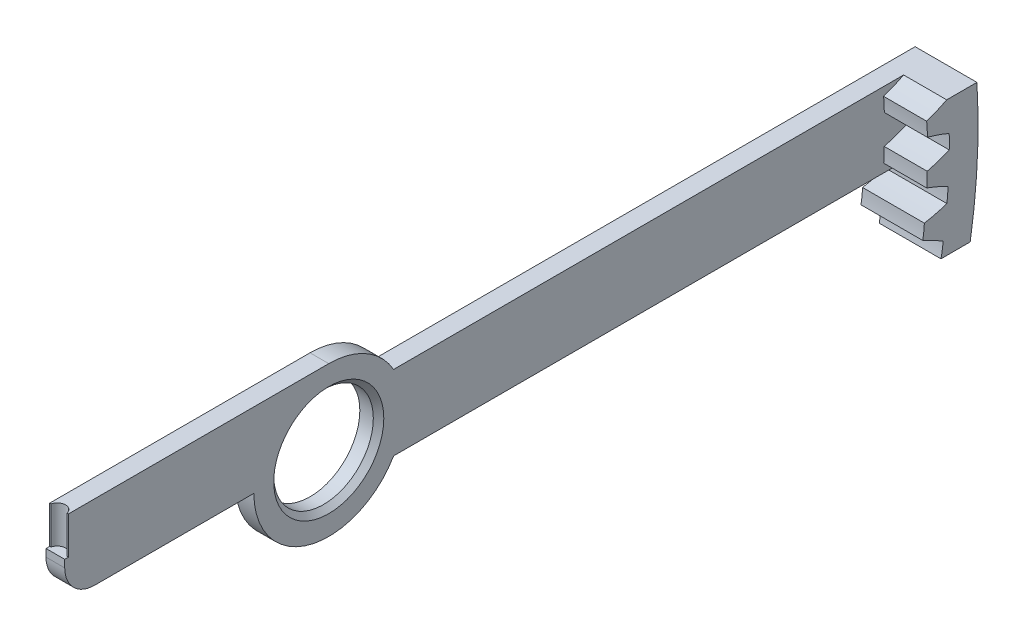
ISO-10303-21;
HEADER;
FILE_DESCRIPTION(('STEP AP214'),'2;1');
FILE_NAME('part.step','',(''),(''),'','','');
FILE_SCHEMA(('AUTOMOTIVE_DESIGN { 1 0 10303 214 1 1 1 1 }'));
ENDSEC;
DATA;
#1=APPLICATION_CONTEXT('core data for automotive mechanical design processes');
#2=APPLICATION_PROTOCOL_DEFINITION('international standard','automotive_design',2000,#1);
#3=PRODUCT_CONTEXT('',#1,'mechanical');
#4=PRODUCT('Part','Part','',(#3));
#5=PRODUCT_RELATED_PRODUCT_CATEGORY('part','',(#4));
#6=PRODUCT_DEFINITION_FORMATION('','',#4);
#7=PRODUCT_DEFINITION_CONTEXT('part definition',#1,'design');
#8=PRODUCT_DEFINITION('design','',#6,#7);
#9=PRODUCT_DEFINITION_SHAPE('','',#8);
#10=(LENGTH_UNIT() NAMED_UNIT(*) SI_UNIT(.MILLI.,.METRE.));
#11=(NAMED_UNIT(*) PLANE_ANGLE_UNIT() SI_UNIT($,.RADIAN.));
#12=(NAMED_UNIT(*) SI_UNIT($,.STERADIAN.) SOLID_ANGLE_UNIT());
#13=UNCERTAINTY_MEASURE_WITH_UNIT(LENGTH_MEASURE(1.E-05),#10,'distance_accuracy_value','');
#14=(GEOMETRIC_REPRESENTATION_CONTEXT(3) GLOBAL_UNCERTAINTY_ASSIGNED_CONTEXT((#13)) GLOBAL_UNIT_ASSIGNED_CONTEXT((#10,
#11,#12)) REPRESENTATION_CONTEXT('',''));
#15=CARTESIAN_POINT('',(0.,0.,0.));
#16=DIRECTION('',(0.,0.,1.));
#17=DIRECTION('',(1.,0.,0.));
#18=AXIS2_PLACEMENT_3D('',#15,#16,#17);
#19=CARTESIAN_POINT('',(-1.25,0.,0.));
#20=DIRECTION('',(1.,0.,0.));
#21=DIRECTION('',(0.,0.,-1.));
#22=AXIS2_PLACEMENT_3D('',#19,#20,#21);
#23=PLANE('',#22);
#24=CARTESIAN_POINT('',(-1.25,0.,0.));
#25=DIRECTION('',(1.,0.,0.));
#26=DIRECTION('',(0.,0.,-1.));
#27=AXIS2_PLACEMENT_3D('',#24,#25,#26);
#28=CIRCLE('',#27,6.65);
#29=CARTESIAN_POINT('',(-1.25,0.,-6.65));
#30=VERTEX_POINT('',#29);
#31=EDGE_CURVE('E323',#30,#30,#28,.T.);
#32=ORIENTED_EDGE('',*,*,#31,.T.);
#33=EDGE_LOOP('',(#32));
#34=FACE_BOUND('',#33,.T.);
#35=DIRECTION('',(0.,0.,-1.));
#36=VECTOR('',#35,1.);
#37=CARTESIAN_POINT('',(-1.25,5.00000000000256,0.));
#38=LINE('',#37,#36);
#39=CARTESIAN_POINT('',(-1.25,5.00000000000215,-8.66025403784314));
#40=VERTEX_POINT('',#39);
#41=CARTESIAN_POINT('',(-1.25,5.00000000000252,-80.7873729860266));
#42=VERTEX_POINT('',#41);
#43=EDGE_CURVE('E377',#40,#42,#38,.T.);
#44=ORIENTED_EDGE('',*,*,#43,.T.);
#45=CARTESIAN_POINT('',(-1.25,0.,0.));
#46=DIRECTION('',(1.,0.,0.));
#47=DIRECTION('',(0.,0.,-1.));
#48=AXIS2_PLACEMENT_3D('',#45,#46,#47);
#49=CIRCLE('',#48,80.9419522496424);
#50=CARTESIAN_POINT('',(-1.25,-13.,-79.8911736926139));
#51=VERTEX_POINT('',#50);
#52=EDGE_CURVE('E228',#51,#42,#49,.T.);
#53=ORIENTED_EDGE('',*,*,#52,.F.);
#54=DIRECTION('',(0.,-0.00180073265699237,0.999998378679635));
#55=VECTOR('',#54,1.);
#56=CARTESIAN_POINT('',(-1.25,-13.143820257931,-0.0236685447503879));
#57=LINE('',#56,#55);
#58=CARTESIAN_POINT('',(-1.25,-13.0070274493974,-75.988629927215));
#59=VERTEX_POINT('',#58);
#60=EDGE_CURVE('E273',#51,#59,#57,.T.);
#61=ORIENTED_EDGE('',*,*,#60,.T.);
#62=CARTESIAN_POINT('',(-1.25,-9.13823875480682,-57.4101745950475));
#63=DIRECTION('',(1.,0.,0.));
#64=DIRECTION('',(0.,0.,-1.));
#65=AXIS2_PLACEMENT_3D('',#62,#63,#64);
#66=CIRCLE('',#65,18.9769999866347);
#67=CARTESIAN_POINT('',(-1.25,-11.1228967498483,-76.2831092141112));
#68=VERTEX_POINT('',#67);
#69=EDGE_CURVE('E289',#68,#59,#66,.F.);
#70=ORIENTED_EDGE('',*,*,#69,.F.);
#71=CARTESIAN_POINT('',(-1.25,-28.8123858408192,-65.0957103825798));
#72=DIRECTION('',(1.,0.,0.));
#73=DIRECTION('',(0.,0.,-1.));
#74=AXIS2_PLACEMENT_3D('',#71,#72,#73);
#75=CIRCLE('',#74,20.9302631831359);
#76=CARTESIAN_POINT('',(-1.25,-9.66965269382754,-73.5592607356179));
#77=VERTEX_POINT('',#76);
#78=EDGE_CURVE('E287',#68,#77,#75,.T.);
#79=ORIENTED_EDGE('',*,*,#78,.T.);
#80=CARTESIAN_POINT('',(-1.25,-6.90534373335352,-57.0702324075885));
#81=DIRECTION('',(1.,0.,0.));
#82=DIRECTION('',(0.,0.,-1.));
#83=AXIS2_PLACEMENT_3D('',#80,#81,#82);
#84=CIRCLE('',#83,16.7191345239971);
#85=CARTESIAN_POINT('',(-1.25,-7.76663181357915,-73.7671675177918));
#86=VERTEX_POINT('',#85);
#87=EDGE_CURVE('E284',#86,#77,#84,.F.);
#88=ORIENTED_EDGE('',*,*,#87,.F.);
#89=CARTESIAN_POINT('',(-1.25,10.9578906175946,-70.6255537554951));
#90=DIRECTION('',(1.,0.,0.));
#91=DIRECTION('',(0.,0.,-1.));
#92=AXIS2_PLACEMENT_3D('',#89,#90,#91);
#93=CIRCLE('',#92,18.9862444234499);
#94=CARTESIAN_POINT('',(-1.25,-7.00493193495975,-76.7749019528595));
#95=VERTEX_POINT('',#94);
#96=EDGE_CURVE('E282',#86,#95,#93,.T.);
#97=ORIENTED_EDGE('',*,*,#96,.T.);
#98=CARTESIAN_POINT('',(-1.25,-4.60571823015363,-57.9501761356954));
#99=DIRECTION('',(1.,0.,0.));
#100=DIRECTION('',(0.,0.,-1.));
#101=AXIS2_PLACEMENT_3D('',#98,#99,#100);
#102=CIRCLE('',#101,18.9769999866347);
#103=CARTESIAN_POINT('',(-1.25,-5.1035048029999,-76.9206462674721));
#104=VERTEX_POINT('',#103);
#105=EDGE_CURVE('E279',#104,#95,#102,.F.);
#106=ORIENTED_EDGE('',*,*,#105,.F.);
#107=CARTESIAN_POINT('',(-1.25,-23.6162162985407,-67.1556357708977));
#108=DIRECTION('',(1.,0.,0.));
#109=DIRECTION('',(0.,0.,-1.));
#110=AXIS2_PLACEMENT_3D('',#107,#108,#109);
#111=CIRCLE('',#110,20.9302631831359);
#112=CARTESIAN_POINT('',(-1.25,-5.00000000000254,-76.7218475415711));
#113=VERTEX_POINT('',#112);
#114=EDGE_CURVE('E276',#104,#113,#111,.T.);
#115=ORIENTED_EDGE('',*,*,#114,.T.);
#116=DIRECTION('',(0.,0.,1.));
#117=VECTOR('',#116,1.);
#118=CARTESIAN_POINT('',(-1.25,-5.00000000000211,0.));
#119=LINE('',#118,#117);
#120=CARTESIAN_POINT('',(-1.25,-5.00000000000216,-8.66025403784314));
#121=VERTEX_POINT('',#120);
#122=EDGE_CURVE('E373',#113,#121,#119,.T.);
#123=ORIENTED_EDGE('',*,*,#122,.T.);
#124=CARTESIAN_POINT('',(-1.25,0.,0.));
#125=DIRECTION('',(1.,0.,0.));
#126=DIRECTION('',(0.,0.,-1.));
#127=AXIS2_PLACEMENT_3D('',#124,#125,#126);
#128=CIRCLE('',#127,10.);
#129=CARTESIAN_POINT('',(-1.25,0.,10.));
#130=VERTEX_POINT('',#129);
#131=EDGE_CURVE('E370',#130,#121,#128,.T.);
#132=ORIENTED_EDGE('',*,*,#131,.F.);
#133=DIRECTION('',(0.,0.,1.));
#134=VECTOR('',#133,1.);
#135=CARTESIAN_POINT('',(-1.25,0.,0.));
#136=LINE('',#135,#134);
#137=CARTESIAN_POINT('',(-1.25,0.,31.25));
#138=VERTEX_POINT('',#137);
#139=EDGE_CURVE('E367',#130,#138,#136,.T.);
#140=ORIENTED_EDGE('',*,*,#139,.T.);
#141=CARTESIAN_POINT('',(-1.25,4.,31.25));
#142=DIRECTION('',(1.,0.,0.));
#143=DIRECTION('',(0.,0.,-1.));
#144=AXIS2_PLACEMENT_3D('',#141,#142,#143);
#145=CIRCLE('',#144,4.);
#146=CARTESIAN_POINT('',(-1.25,4.00000000000002,35.25));
#147=VERTEX_POINT('',#146);
#148=EDGE_CURVE('E364',#147,#138,#145,.T.);
#149=ORIENTED_EDGE('',*,*,#148,.F.);
#150=DIRECTION('',(0.,-1.,0.));
#151=VECTOR('',#150,1.);
#152=CARTESIAN_POINT('',(-1.25,0.,35.25));
#153=LINE('',#152,#151);
#154=CARTESIAN_POINT('',(-1.25,4.99999999999999,35.25));
#155=VERTEX_POINT('',#154);
#156=EDGE_CURVE('E295',#155,#147,#153,.T.);
#157=ORIENTED_EDGE('',*,*,#156,.F.);
#158=DIRECTION('',(0.,0.,-1.));
#159=VECTOR('',#158,1.);
#160=CARTESIAN_POINT('',(-1.25,4.99999999999999,0.));
#161=LINE('',#160,#159);
#162=CARTESIAN_POINT('',(-1.25,4.99999999999999,34.75));
#163=VERTEX_POINT('',#162);
#164=EDGE_CURVE('E385',#155,#163,#161,.T.);
#165=ORIENTED_EDGE('',*,*,#164,.T.);
#166=DIRECTION('',(0.,-1.,0.));
#167=VECTOR('',#166,1.);
#168=CARTESIAN_POINT('',(-1.25,0.,34.75));
#169=LINE('',#168,#167);
#170=CARTESIAN_POINT('',(-1.25,9.99999999999999,34.75));
#171=VERTEX_POINT('',#170);
#172=EDGE_CURVE('E382',#171,#163,#169,.T.);
#173=ORIENTED_EDGE('',*,*,#172,.F.);
#174=DIRECTION('',(0.,0.,1.));
#175=VECTOR('',#174,1.);
#176=CARTESIAN_POINT('',(-1.25,9.99999999999999,0.));
#177=LINE('',#176,#175);
#178=CARTESIAN_POINT('',(-1.25,9.99999999999999,0.));
#179=VERTEX_POINT('',#178);
#180=EDGE_CURVE('E379',#179,#171,#177,.T.);
#181=ORIENTED_EDGE('',*,*,#180,.F.);
#182=EDGE_CURVE('E374',#40,#179,#128,.T.);
#183=ORIENTED_EDGE('',*,*,#182,.F.);
#184=EDGE_LOOP('',(#44,#53,#61,#70,#79,#88,#97,#106,#115,#123,#132,#140,#149,#157,#165,#173,
#181,#183));
#185=FACE_BOUND('',#184,.T.);
#186=ADVANCED_FACE('F37',(#34,#185),#23,.F.);
#187=CARTESIAN_POINT('',(-1.25,21.8712515204259,-68.0418442356442));
#188=DIRECTION('',(1.,0.,0.));
#189=DIRECTION('',(0.,0.,-1.));
#190=AXIS2_PLACEMENT_3D('',#187,#188,#189);
#191=CYLINDRICAL_SURFACE('',#190,18.9862444234499);
#192=DIRECTION('',(1.,0.,0.));
#193=VECTOR('',#192,1.);
#194=CARTESIAN_POINT('',(-1.25,5.00000000000252,-76.7503658921365));
#195=LINE('',#194,#193);
#196=CARTESIAN_POINT('',(1.25,5.00000000000252,-76.7503658921365));
#197=VERTEX_POINT('',#196);
#198=CARTESIAN_POINT('',(7.,5.00000000000252,-76.7503658921365));
#199=VERTEX_POINT('',#198);
#200=EDGE_CURVE('E52',#197,#199,#195,.T.);
#201=ORIENTED_EDGE('',*,*,#200,.F.);
#202=CARTESIAN_POINT('',(1.25,21.8712515204259,-68.0418442356442));
#203=DIRECTION('',(1.,0.,0.));
#204=DIRECTION('',(0.,0.,-1.));
#205=AXIS2_PLACEMENT_3D('',#202,#203,#204);
#206=CIRCLE('',#205,18.9862444234499);
#207=CARTESIAN_POINT('',(1.25,3.86871570021124,-74.0739401689721));
#208=VERTEX_POINT('',#207);
#209=EDGE_CURVE('E349',#208,#197,#206,.T.);
#210=ORIENTED_EDGE('',*,*,#209,.F.);
#211=DIRECTION('',(1.,0.,0.));
#212=VECTOR('',#211,1.);
#213=CARTESIAN_POINT('',(-1.25,3.86871570021124,-74.0739401689721));
#214=LINE('',#213,#212);
#215=CARTESIAN_POINT('',(7.,3.86871570021124,-74.0739401689721));
#216=VERTEX_POINT('',#215);
#217=EDGE_CURVE('E316',#208,#216,#214,.T.);
#218=ORIENTED_EDGE('',*,*,#217,.T.);
#219=CARTESIAN_POINT('',(7.,21.8712515204259,-68.0418442356442));
#220=DIRECTION('',(1.,0.,0.));
#221=DIRECTION('',(0.,0.,-1.));
#222=AXIS2_PLACEMENT_3D('',#219,#220,#221);
#223=CIRCLE('',#222,18.9862444234499);
#224=EDGE_CURVE('E234',#216,#199,#223,.T.);
#225=ORIENTED_EDGE('',*,*,#224,.T.);
#226=EDGE_LOOP('',(#201,#210,#218,#225));
#227=FACE_BOUND('',#226,.T.);
#228=ADVANCED_FACE('F437',(#227),#191,.F.);
#229=CARTESIAN_POINT('',(-1.25,0.,0.));
#230=DIRECTION('',(1.,0.,0.));
#231=DIRECTION('',(0.,0.,-1.));
#232=AXIS2_PLACEMENT_3D('',#229,#230,#231);
#233=CYLINDRICAL_SURFACE('',#232,80.9419522496424);
#234=ORIENTED_EDGE('',*,*,#52,.T.);
#235=DIRECTION('',(1.,0.,0.));
#236=VECTOR('',#235,1.);
#237=CARTESIAN_POINT('',(-1.25,5.00000000000252,-80.7873729860266));
#238=LINE('',#237,#236);
#239=CARTESIAN_POINT('',(7.,5.00000000000252,-80.7873729860266));
#240=VERTEX_POINT('',#239);
#241=EDGE_CURVE('E216',#42,#240,#238,.T.);
#242=ORIENTED_EDGE('',*,*,#241,.T.);
#243=CARTESIAN_POINT('',(7.,0.,0.));
#244=DIRECTION('',(1.,0.,0.));
#245=DIRECTION('',(0.,0.,-1.));
#246=AXIS2_PLACEMENT_3D('',#243,#244,#245);
#247=CIRCLE('',#246,80.9419522496424);
#248=CARTESIAN_POINT('',(7.,-13.,-79.8911736926139));
#249=VERTEX_POINT('',#248);
#250=EDGE_CURVE('E225',#249,#240,#247,.T.);
#251=ORIENTED_EDGE('',*,*,#250,.F.);
#252=DIRECTION('',(1.,0.,0.));
#253=VECTOR('',#252,1.);
#254=CARTESIAN_POINT('',(-1.25,-13.,-79.8911736926139));
#255=LINE('',#254,#253);
#256=EDGE_CURVE('E292',#51,#249,#255,.T.);
#257=ORIENTED_EDGE('',*,*,#256,.F.);
#258=EDGE_LOOP('',(#234,#242,#251,#257));
#259=FACE_BOUND('',#258,.T.);
#260=ADVANCED_FACE('F224',(#259),#233,.T.);
#261=CARTESIAN_POINT('',(7.,0.,0.));
#262=DIRECTION('',(1.,0.,0.));
#263=DIRECTION('',(0.,0.,-1.));
#264=AXIS2_PLACEMENT_3D('',#261,#262,#263);
#265=PLANE('',#264);
#266=ORIENTED_EDGE('',*,*,#250,.T.);
#267=DIRECTION('',(0.,0.,1.));
#268=VECTOR('',#267,1.);
#269=CARTESIAN_POINT('',(7.,5.00000000000252,0.));
#270=LINE('',#269,#268);
#271=EDGE_CURVE('E11',#240,#199,#270,.T.);
#272=ORIENTED_EDGE('',*,*,#271,.T.);
#273=ORIENTED_EDGE('',*,*,#224,.F.);
#274=CARTESIAN_POINT('',(7.,2.10742378316781,-57.447836896876));
#275=DIRECTION('',(1.,0.,0.));
#276=DIRECTION('',(0.,0.,-1.));
#277=AXIS2_PLACEMENT_3D('',#274,#275,#276);
#278=CIRCLE('',#277,16.7191345239952);
#279=CARTESIAN_POINT('',(7.,1.95660037863342,-74.1662911176493));
#280=VERTEX_POINT('',#279);
#281=EDGE_CURVE('E236',#216,#280,#278,.F.);
#282=ORIENTED_EDGE('',*,*,#281,.T.);
#283=CARTESIAN_POINT('',(7.,-18.2744449295929,-68.8015243331729));
#284=DIRECTION('',(1.,0.,0.));
#285=DIRECTION('',(0.,0.,-1.));
#286=AXIS2_PLACEMENT_3D('',#283,#284,#285);
#287=CIRCLE('',#286,20.9302631831357);
#288=CARTESIAN_POINT('',(7.,0.947351948046231,-77.0839419578831));
#289=VERTEX_POINT('',#288);
#290=EDGE_CURVE('E244',#289,#280,#287,.T.);
#291=ORIENTED_EDGE('',*,*,#290,.F.);
#292=CARTESIAN_POINT('',(7.,-0.0448019210548617,-58.1328955700775));
#293=DIRECTION('',(1.,0.,0.));
#294=DIRECTION('',(0.,0.,-1.));
#295=AXIS2_PLACEMENT_3D('',#292,#293,#294);
#296=CIRCLE('',#295,18.9769999866347);
#297=CARTESIAN_POINT('',(7.,-0.959648685766831,-77.0878311777188));
#298=VERTEX_POINT('',#297);
#299=EDGE_CURVE('E247',#289,#298,#296,.F.);
#300=ORIENTED_EDGE('',*,*,#299,.T.);
#301=CARTESIAN_POINT('',(7.,16.4653281807661,-69.5480925544124));
#302=DIRECTION('',(1.,0.,0.));
#303=DIRECTION('',(0.,0.,-1.));
#304=AXIS2_PLACEMENT_3D('',#301,#302,#303);
#305=CIRCLE('',#304,18.9862444234499);
#306=CARTESIAN_POINT('',(7.,-1.95498462182996,-74.1491308678259));
#307=VERTEX_POINT('',#306);
#308=EDGE_CURVE('E250',#307,#298,#305,.T.);
#309=ORIENTED_EDGE('',*,*,#308,.F.);
#310=CARTESIAN_POINT('',(7.,-2.40637803548819,-57.436090952312));
#311=DIRECTION('',(1.,0.,0.));
#312=DIRECTION('',(0.,0.,-1.));
#313=AXIS2_PLACEMENT_3D('',#310,#311,#312);
#314=CIRCLE('',#313,16.7191345239954);
#315=CARTESIAN_POINT('',(7.,-3.8684513019306,-74.0911742902917));
#316=VERTEX_POINT('',#315);
#317=EDGE_CURVE('E253',#307,#316,#314,.F.);
#318=ORIENTED_EDGE('',*,*,#317,.T.);
#319=CARTESIAN_POINT('',(7.,-23.6162162985407,-67.1556357708977));
#320=DIRECTION('',(1.,0.,0.));
#321=DIRECTION('',(0.,0.,-1.));
#322=AXIS2_PLACEMENT_3D('',#319,#320,#321);
#323=CIRCLE('',#322,20.9302631831359);
#324=CARTESIAN_POINT('',(7.,-5.1035048029999,-76.9206462674721));
#325=VERTEX_POINT('',#324);
#326=EDGE_CURVE('E256',#325,#316,#323,.T.);
#327=ORIENTED_EDGE('',*,*,#326,.F.);
#328=CARTESIAN_POINT('',(7.,-4.60571823015363,-57.9501761356954));
#329=DIRECTION('',(1.,0.,0.));
#330=DIRECTION('',(0.,0.,-1.));
#331=AXIS2_PLACEMENT_3D('',#328,#329,#330);
#332=CIRCLE('',#331,18.9769999866347);
#333=CARTESIAN_POINT('',(7.,-7.00493193495975,-76.7749019528595));
#334=VERTEX_POINT('',#333);
#335=EDGE_CURVE('E259',#325,#334,#332,.F.);
#336=ORIENTED_EDGE('',*,*,#335,.T.);
#337=CARTESIAN_POINT('',(7.,10.9578906175946,-70.6255537554951));
#338=DIRECTION('',(1.,0.,0.));
#339=DIRECTION('',(0.,0.,-1.));
#340=AXIS2_PLACEMENT_3D('',#337,#338,#339);
#341=CIRCLE('',#340,18.9862444234499);
#342=CARTESIAN_POINT('',(7.,-7.76663181357915,-73.7671675177918));
#343=VERTEX_POINT('',#342);
#344=EDGE_CURVE('E262',#343,#334,#341,.T.);
#345=ORIENTED_EDGE('',*,*,#344,.F.);
#346=CARTESIAN_POINT('',(7.,-6.90534373335352,-57.0702324075885));
#347=DIRECTION('',(1.,0.,0.));
#348=DIRECTION('',(0.,0.,-1.));
#349=AXIS2_PLACEMENT_3D('',#346,#347,#348);
#350=CIRCLE('',#349,16.7191345239971);
#351=CARTESIAN_POINT('',(7.,-9.66965269382754,-73.5592607356179));
#352=VERTEX_POINT('',#351);
#353=EDGE_CURVE('E265',#343,#352,#350,.F.);
#354=ORIENTED_EDGE('',*,*,#353,.T.);
#355=CARTESIAN_POINT('',(7.,-28.8123858408192,-65.0957103825798));
#356=DIRECTION('',(1.,0.,0.));
#357=DIRECTION('',(0.,0.,-1.));
#358=AXIS2_PLACEMENT_3D('',#355,#356,#357);
#359=CIRCLE('',#358,20.9302631831359);
#360=CARTESIAN_POINT('',(7.,-11.1228967498483,-76.2831092141112));
#361=VERTEX_POINT('',#360);
#362=EDGE_CURVE('E268',#361,#352,#359,.T.);
#363=ORIENTED_EDGE('',*,*,#362,.F.);
#364=CARTESIAN_POINT('',(7.,-9.13823875480682,-57.4101745950475));
#365=DIRECTION('',(1.,0.,0.));
#366=DIRECTION('',(0.,0.,-1.));
#367=AXIS2_PLACEMENT_3D('',#364,#365,#366);
#368=CIRCLE('',#367,18.9769999866347);
#369=CARTESIAN_POINT('',(7.,-13.0070274493974,-75.988629927215));
#370=VERTEX_POINT('',#369);
#371=EDGE_CURVE('E271',#361,#370,#368,.F.);
#372=ORIENTED_EDGE('',*,*,#371,.T.);
#373=DIRECTION('',(0.,-0.00180073265699237,0.999998378679635));
#374=VECTOR('',#373,1.);
#375=CARTESIAN_POINT('',(7.,-13.143820257931,-0.0236685447503879));
#376=LINE('',#375,#374);
#377=EDGE_CURVE('E233',#249,#370,#376,.T.);
#378=ORIENTED_EDGE('',*,*,#377,.F.);
#379=EDGE_LOOP('',(#266,#272,#273,#282,#291,#300,#309,#318,#327,#336,#345,#354,#363,#372,#378));
#380=FACE_BOUND('',#379,.T.);
#381=ADVANCED_FACE('F230',(#380),#265,.T.);
#382=CARTESIAN_POINT('',(1.25,0.,34.75));
#383=DIRECTION('',(0.,0.,-1.));
#384=DIRECTION('',(-1.,0.,0.));
#385=AXIS2_PLACEMENT_3D('',#382,#383,#384);
#386=PLANE('',#385);
#387=DIRECTION('',(-1.,0.,0.));
#388=VECTOR('',#387,1.);
#389=CARTESIAN_POINT('',(1.25,4.99999999999999,34.75));
#390=LINE('',#389,#388);
#391=CARTESIAN_POINT('',(-1.07121426428143,4.99999999999999,34.75));
#392=VERTEX_POINT('',#391);
#393=EDGE_CURVE('E391',#392,#163,#390,.T.);
#394=ORIENTED_EDGE('',*,*,#393,.F.);
#395=DIRECTION('',(0.,1.,0.));
#396=VECTOR('',#395,1.);
#397=CARTESIAN_POINT('',(-1.07121426428143,4.99999999999999,34.75));
#398=LINE('',#397,#396);
#399=CARTESIAN_POINT('',(-1.07121426428143,9.99999999999999,34.75));
#400=VERTEX_POINT('',#399);
#401=EDGE_CURVE('E238',#392,#400,#398,.T.);
#402=ORIENTED_EDGE('',*,*,#401,.T.);
#403=DIRECTION('',(-1.,0.,0.));
#404=VECTOR('',#403,1.);
#405=CARTESIAN_POINT('',(1.25,9.99999999999999,34.75));
#406=LINE('',#405,#404);
#407=EDGE_CURVE('E394',#400,#171,#406,.T.);
#408=ORIENTED_EDGE('',*,*,#407,.T.);
#409=ORIENTED_EDGE('',*,*,#172,.T.);
#410=EDGE_LOOP('',(#394,#402,#408,#409));
#411=FACE_BOUND('',#410,.T.);
#412=ADVANCED_FACE('F528',(#411),#386,.F.);
#413=CARTESIAN_POINT('',(1.25,0.,35.25));
#414=DIRECTION('',(0.,0.,-1.));
#415=DIRECTION('',(-1.,0.,0.));
#416=AXIS2_PLACEMENT_3D('',#413,#414,#415);
#417=PLANE('',#416);
#418=ORIENTED_EDGE('',*,*,#156,.T.);
#419=DIRECTION('',(-1.,0.,0.));
#420=VECTOR('',#419,1.);
#421=CARTESIAN_POINT('',(1.25,4.00000000000002,35.25));
#422=LINE('',#421,#420);
#423=CARTESIAN_POINT('',(1.25,4.00000000000002,35.25));
#424=VERTEX_POINT('',#423);
#425=EDGE_CURVE('E412',#424,#147,#422,.T.);
#426=ORIENTED_EDGE('',*,*,#425,.F.);
#427=DIRECTION('',(0.,-1.,0.));
#428=VECTOR('',#427,1.);
#429=CARTESIAN_POINT('',(1.25,0.,35.25));
#430=LINE('',#429,#428);
#431=CARTESIAN_POINT('',(1.25,4.99999999999999,35.25));
#432=VERTEX_POINT('',#431);
#433=EDGE_CURVE('E319',#432,#424,#430,.T.);
#434=ORIENTED_EDGE('',*,*,#433,.F.);
#435=DIRECTION('',(-1.,0.,0.));
#436=VECTOR('',#435,1.);
#437=CARTESIAN_POINT('',(1.25,4.99999999999999,35.25));
#438=LINE('',#437,#436);
#439=EDGE_CURVE('E361',#432,#155,#438,.T.);
#440=ORIENTED_EDGE('',*,*,#439,.T.);
#441=EDGE_LOOP('',(#418,#426,#434,#440));
#442=FACE_BOUND('',#441,.T.);
#443=ADVANCED_FACE('F523',(#442),#417,.F.);
#444=CARTESIAN_POINT('',(1.25,4.,31.25));
#445=DIRECTION('',(-1.,0.,0.));
#446=DIRECTION('',(0.,0.,1.));
#447=AXIS2_PLACEMENT_3D('',#444,#445,#446);
#448=CYLINDRICAL_SURFACE('',#447,4.);
#449=ORIENTED_EDGE('',*,*,#148,.T.);
#450=DIRECTION('',(-1.,0.,0.));
#451=VECTOR('',#450,1.);
#452=CARTESIAN_POINT('',(1.25,0.,31.25));
#453=LINE('',#452,#451);
#454=CARTESIAN_POINT('',(1.25,0.,31.25));
#455=VERTEX_POINT('',#454);
#456=EDGE_CURVE('E410',#455,#138,#453,.T.);
#457=ORIENTED_EDGE('',*,*,#456,.F.);
#458=CARTESIAN_POINT('',(1.25,4.,31.25));
#459=DIRECTION('',(1.,0.,0.));
#460=DIRECTION('',(0.,0.,-1.));
#461=AXIS2_PLACEMENT_3D('',#458,#459,#460);
#462=CIRCLE('',#461,4.);
#463=EDGE_CURVE('E322',#424,#455,#462,.T.);
#464=ORIENTED_EDGE('',*,*,#463,.F.);
#465=ORIENTED_EDGE('',*,*,#425,.T.);
#466=EDGE_LOOP('',(#449,#457,#464,#465));
#467=FACE_BOUND('',#466,.T.);
#468=ADVANCED_FACE('F520',(#467),#448,.T.);
#469=CARTESIAN_POINT('',(1.25,0.,0.));
#470=DIRECTION('',(0.,-1.,0.));
#471=DIRECTION('',(0.,0.,-1.));
#472=AXIS2_PLACEMENT_3D('',#469,#470,#471);
#473=PLANE('',#472);
#474=ORIENTED_EDGE('',*,*,#139,.F.);
#475=DIRECTION('',(-1.,0.,0.));
#476=VECTOR('',#475,1.);
#477=CARTESIAN_POINT('',(1.25,0.,10.));
#478=LINE('',#477,#476);
#479=CARTESIAN_POINT('',(1.25,0.,10.));
#480=VERTEX_POINT('',#479);
#481=EDGE_CURVE('E408',#480,#130,#478,.T.);
#482=ORIENTED_EDGE('',*,*,#481,.F.);
#483=DIRECTION('',(0.,0.,1.));
#484=VECTOR('',#483,1.);
#485=CARTESIAN_POINT('',(1.25,0.,0.));
#486=LINE('',#485,#484);
#487=EDGE_CURVE('E325',#480,#455,#486,.T.);
#488=ORIENTED_EDGE('',*,*,#487,.T.);
#489=ORIENTED_EDGE('',*,*,#456,.T.);
#490=EDGE_LOOP('',(#474,#482,#488,#489));
#491=FACE_BOUND('',#490,.T.);
#492=ADVANCED_FACE('F514',(#491),#473,.T.);
#493=CARTESIAN_POINT('',(1.25,0.,0.));
#494=DIRECTION('',(-1.,0.,0.));
#495=DIRECTION('',(0.,0.,1.));
#496=AXIS2_PLACEMENT_3D('',#493,#494,#495);
#497=CYLINDRICAL_SURFACE('',#496,10.);
#498=ORIENTED_EDGE('',*,*,#131,.T.);
#499=DIRECTION('',(-1.,0.,0.));
#500=VECTOR('',#499,1.);
#501=CARTESIAN_POINT('',(1.25,-5.00000000000216,-8.66025403784314));
#502=LINE('',#501,#500);
#503=CARTESIAN_POINT('',(1.25,-5.00000000000216,-8.66025403784314));
#504=VERTEX_POINT('',#503);
#505=EDGE_CURVE('E406',#504,#121,#502,.T.);
#506=ORIENTED_EDGE('',*,*,#505,.F.);
#507=CARTESIAN_POINT('',(1.25,0.,0.));
#508=DIRECTION('',(1.,0.,0.));
#509=DIRECTION('',(0.,0.,-1.));
#510=AXIS2_PLACEMENT_3D('',#507,#508,#509);
#511=CIRCLE('',#510,10.);
#512=EDGE_CURVE('E328',#480,#504,#511,.T.);
#513=ORIENTED_EDGE('',*,*,#512,.F.);
#514=ORIENTED_EDGE('',*,*,#481,.T.);
#515=EDGE_LOOP('',(#498,#506,#513,#514));
#516=FACE_BOUND('',#515,.T.);
#517=ADVANCED_FACE('F512',(#516),#497,.T.);
#518=CARTESIAN_POINT('',(1.25,-5.00000000000211,0.));
#519=DIRECTION('',(0.,-1.,0.));
#520=DIRECTION('',(0.,0.,-1.));
#521=AXIS2_PLACEMENT_3D('',#518,#519,#520);
#522=PLANE('',#521);
#523=ORIENTED_EDGE('',*,*,#122,.F.);
#524=DIRECTION('',(-1.,0.,0.));
#525=VECTOR('',#524,1.);
#526=CARTESIAN_POINT('',(1.25,-5.00000000000254,-76.7218475415711));
#527=LINE('',#526,#525);
#528=CARTESIAN_POINT('',(1.25,-5.00000000000254,-76.7218475415711));
#529=VERTEX_POINT('',#528);
#530=EDGE_CURVE('E403',#529,#113,#527,.T.);
#531=ORIENTED_EDGE('',*,*,#530,.F.);
#532=DIRECTION('',(0.,0.,1.));
#533=VECTOR('',#532,1.);
#534=CARTESIAN_POINT('',(1.25,-5.00000000000211,0.));
#535=LINE('',#534,#533);
#536=EDGE_CURVE('E330',#529,#504,#535,.T.);
#537=ORIENTED_EDGE('',*,*,#536,.T.);
#538=ORIENTED_EDGE('',*,*,#505,.T.);
#539=EDGE_LOOP('',(#523,#531,#537,#538));
#540=FACE_BOUND('',#539,.T.);
#541=ADVANCED_FACE('F506',(#540),#522,.T.);
#542=CARTESIAN_POINT('',(1.25,5.00000000000256,0.));
#543=DIRECTION('',(0.,1.,0.));
#544=DIRECTION('',(0.,0.,1.));
#545=AXIS2_PLACEMENT_3D('',#542,#543,#544);
#546=PLANE('',#545);
#547=ORIENTED_EDGE('',*,*,#241,.F.);
#548=ORIENTED_EDGE('',*,*,#43,.F.);
#549=DIRECTION('',(-1.,0.,0.));
#550=VECTOR('',#549,1.);
#551=CARTESIAN_POINT('',(1.25,5.00000000000215,-8.66025403784314));
#552=LINE('',#551,#550);
#553=CARTESIAN_POINT('',(1.25,5.00000000000215,-8.66025403784314));
#554=VERTEX_POINT('',#553);
#555=EDGE_CURVE('E401',#554,#40,#552,.T.);
#556=ORIENTED_EDGE('',*,*,#555,.F.);
#557=DIRECTION('',(0.,0.,-1.));
#558=VECTOR('',#557,1.);
#559=CARTESIAN_POINT('',(1.25,5.00000000000256,0.));
#560=LINE('',#559,#558);
#561=EDGE_CURVE('E352',#554,#197,#560,.T.);
#562=ORIENTED_EDGE('',*,*,#561,.T.);
#563=ORIENTED_EDGE('',*,*,#200,.T.);
#564=ORIENTED_EDGE('',*,*,#271,.F.);
#565=EDGE_LOOP('',(#547,#548,#556,#562,#563,#564));
#566=FACE_BOUND('',#565,.T.);
#567=ADVANCED_FACE('F214',(#566),#546,.T.);
#568=ORIENTED_EDGE('',*,*,#182,.T.);
#569=DIRECTION('',(-1.,0.,0.));
#570=VECTOR('',#569,1.);
#571=CARTESIAN_POINT('',(1.25,9.99999999999999,0.));
#572=LINE('',#571,#570);
#573=CARTESIAN_POINT('',(1.25,9.99999999999999,0.));
#574=VERTEX_POINT('',#573);
#575=EDGE_CURVE('E398',#574,#179,#572,.T.);
#576=ORIENTED_EDGE('',*,*,#575,.F.);
#577=EDGE_CURVE('E331',#554,#574,#511,.T.);
#578=ORIENTED_EDGE('',*,*,#577,.F.);
#579=ORIENTED_EDGE('',*,*,#555,.T.);
#580=EDGE_LOOP('',(#568,#576,#578,#579));
#581=FACE_BOUND('',#580,.T.);
#582=ADVANCED_FACE('F445',(#581),#497,.T.);
#583=CARTESIAN_POINT('',(1.25,9.99999999999999,0.));
#584=DIRECTION('',(0.,-1.,0.));
#585=DIRECTION('',(0.,0.,-1.));
#586=AXIS2_PLACEMENT_3D('',#583,#584,#585);
#587=PLANE('',#586);
#588=ORIENTED_EDGE('',*,*,#407,.F.);
#589=CARTESIAN_POINT('',(0.,9.99999999999999,35.));
#590=DIRECTION('',(0.,1.,0.));
#591=DIRECTION('',(0.,0.,1.));
#592=AXIS2_PLACEMENT_3D('',#589,#590,#591);
#593=CIRCLE('',#592,1.1);
#594=CARTESIAN_POINT('',(1.07121426428143,9.99999999999999,34.75));
#595=VERTEX_POINT('',#594);
#596=EDGE_CURVE('E543',#595,#400,#593,.T.);
#597=ORIENTED_EDGE('',*,*,#596,.F.);
#598=CARTESIAN_POINT('',(1.25,9.99999999999999,34.75));
#599=VERTEX_POINT('',#598);
#600=EDGE_CURVE('E395',#599,#595,#406,.T.);
#601=ORIENTED_EDGE('',*,*,#600,.F.);
#602=DIRECTION('',(0.,0.,1.));
#603=VECTOR('',#602,1.);
#604=CARTESIAN_POINT('',(1.25,9.99999999999999,0.));
#605=LINE('',#604,#603);
#606=EDGE_CURVE('E354',#574,#599,#605,.T.);
#607=ORIENTED_EDGE('',*,*,#606,.F.);
#608=ORIENTED_EDGE('',*,*,#575,.T.);
#609=ORIENTED_EDGE('',*,*,#180,.T.);
#610=EDGE_LOOP('',(#588,#597,#601,#607,#608,#609));
#611=FACE_BOUND('',#610,.T.);
#612=ADVANCED_FACE('F533',(#611),#587,.F.);
#613=ORIENTED_EDGE('',*,*,#600,.T.);
#614=DIRECTION('',(0.,1.,0.));
#615=VECTOR('',#614,1.);
#616=CARTESIAN_POINT('',(1.07121426428143,4.99999999999999,34.75));
#617=LINE('',#616,#615);
#618=CARTESIAN_POINT('',(1.07121426428143,4.99999999999999,34.75));
#619=VERTEX_POINT('',#618);
#620=EDGE_CURVE('E540',#595,#619,#617,.F.);
#621=ORIENTED_EDGE('',*,*,#620,.T.);
#622=CARTESIAN_POINT('',(1.25,4.99999999999999,34.75));
#623=VERTEX_POINT('',#622);
#624=EDGE_CURVE('E392',#623,#619,#390,.T.);
#625=ORIENTED_EDGE('',*,*,#624,.F.);
#626=DIRECTION('',(0.,-1.,0.));
#627=VECTOR('',#626,1.);
#628=CARTESIAN_POINT('',(1.25,0.,34.75));
#629=LINE('',#628,#627);
#630=EDGE_CURVE('E356',#599,#623,#629,.T.);
#631=ORIENTED_EDGE('',*,*,#630,.F.);
#632=EDGE_LOOP('',(#613,#621,#625,#631));
#633=FACE_BOUND('',#632,.T.);
#634=ADVANCED_FACE('F539',(#633),#386,.F.);
#635=CARTESIAN_POINT('',(1.25,4.99999999999999,0.));
#636=DIRECTION('',(0.,1.,0.));
#637=DIRECTION('',(0.,0.,1.));
#638=AXIS2_PLACEMENT_3D('',#635,#636,#637);
#639=PLANE('',#638);
#640=ORIENTED_EDGE('',*,*,#164,.F.);
#641=ORIENTED_EDGE('',*,*,#439,.F.);
#642=DIRECTION('',(0.,0.,-1.));
#643=VECTOR('',#642,1.);
#644=CARTESIAN_POINT('',(1.25,4.99999999999999,0.));
#645=LINE('',#644,#643);
#646=EDGE_CURVE('E358',#432,#623,#645,.T.);
#647=ORIENTED_EDGE('',*,*,#646,.T.);
#648=ORIENTED_EDGE('',*,*,#624,.T.);
#649=CARTESIAN_POINT('',(0.,4.99999999999999,35.));
#650=DIRECTION('',(0.,1.,0.));
#651=DIRECTION('',(0.,0.,1.));
#652=AXIS2_PLACEMENT_3D('',#649,#650,#651);
#653=CIRCLE('',#652,1.1);
#654=EDGE_CURVE('E59',#619,#392,#653,.T.);
#655=ORIENTED_EDGE('',*,*,#654,.T.);
#656=ORIENTED_EDGE('',*,*,#393,.T.);
#657=EDGE_LOOP('',(#640,#641,#647,#648,#655,#656));
#658=FACE_BOUND('',#657,.T.);
#659=ADVANCED_FACE('F431',(#658),#639,.T.);
#660=CARTESIAN_POINT('',(1.25,0.,0.));
#661=DIRECTION('',(-1.,0.,0.));
#662=DIRECTION('',(0.,0.,1.));
#663=AXIS2_PLACEMENT_3D('',#660,#661,#662);
#664=CYLINDRICAL_SURFACE('',#663,6.65);
#665=CARTESIAN_POINT('',(0.550000000000037,0.,0.));
#666=DIRECTION('',(1.,0.,0.));
#667=DIRECTION('',(0.,0.,-1.));
#668=AXIS2_PLACEMENT_3D('',#665,#666,#667);
#669=CIRCLE('',#668,6.65);
#670=CARTESIAN_POINT('',(0.550000000000037,0.,-6.65));
#671=VERTEX_POINT('',#670);
#672=EDGE_CURVE('E415',#671,#671,#669,.T.);
#673=ORIENTED_EDGE('',*,*,#672,.T.);
#674=EDGE_LOOP('',(#673));
#675=FACE_BOUND('',#674,.T.);
#676=ORIENTED_EDGE('',*,*,#31,.F.);
#677=EDGE_LOOP('',(#676));
#678=FACE_BOUND('',#677,.T.);
#679=ADVANCED_FACE('F428',(#675,#678),#664,.F.);
#680=CARTESIAN_POINT('',(1.25,0.,0.));
#681=DIRECTION('',(1.,0.,0.));
#682=DIRECTION('',(0.,0.,-1.));
#683=AXIS2_PLACEMENT_3D('',#680,#681,#682);
#684=PLANE('',#683);
#685=CARTESIAN_POINT('',(1.25,0.,0.));
#686=DIRECTION('',(1.,0.,0.));
#687=DIRECTION('',(0.,0.,-1.));
#688=AXIS2_PLACEMENT_3D('',#685,#686,#687);
#689=CIRCLE('',#688,7.34999999999997);
#690=CARTESIAN_POINT('',(1.25,0.,-7.34999999999997));
#691=VERTEX_POINT('',#690);
#692=EDGE_CURVE('E45',#691,#691,#689,.F.);
#693=ORIENTED_EDGE('',*,*,#692,.T.);
#694=EDGE_LOOP('',(#693));
#695=FACE_BOUND('',#694,.T.);
#696=ORIENTED_EDGE('',*,*,#433,.T.);
#697=ORIENTED_EDGE('',*,*,#463,.T.);
#698=ORIENTED_EDGE('',*,*,#487,.F.);
#699=ORIENTED_EDGE('',*,*,#512,.T.);
#700=ORIENTED_EDGE('',*,*,#536,.F.);
#701=CARTESIAN_POINT('',(1.25,-23.6162162985407,-67.1556357708977));
#702=DIRECTION('',(1.,0.,0.));
#703=DIRECTION('',(0.,0.,-1.));
#704=AXIS2_PLACEMENT_3D('',#701,#702,#703);
#705=CIRCLE('',#704,20.9302631831359);
#706=CARTESIAN_POINT('',(1.25,-3.8684513019306,-74.0911742902917));
#707=VERTEX_POINT('',#706);
#708=EDGE_CURVE('E334',#529,#707,#705,.T.);
#709=ORIENTED_EDGE('',*,*,#708,.T.);
#710=CARTESIAN_POINT('',(1.25,-2.40637803548819,-57.436090952312));
#711=DIRECTION('',(1.,0.,0.));
#712=DIRECTION('',(0.,0.,-1.));
#713=AXIS2_PLACEMENT_3D('',#710,#711,#712);
#714=CIRCLE('',#713,16.7191345239954);
#715=CARTESIAN_POINT('',(1.25,-1.95498462182996,-74.1491308678259));
#716=VERTEX_POINT('',#715);
#717=EDGE_CURVE('E336',#716,#707,#714,.F.);
#718=ORIENTED_EDGE('',*,*,#717,.F.);
#719=CARTESIAN_POINT('',(1.25,16.4653281807661,-69.5480925544124));
#720=DIRECTION('',(1.,0.,0.));
#721=DIRECTION('',(0.,0.,-1.));
#722=AXIS2_PLACEMENT_3D('',#719,#720,#721);
#723=CIRCLE('',#722,18.9862444234499);
#724=CARTESIAN_POINT('',(1.25,-0.959648685766831,-77.0878311777188));
#725=VERTEX_POINT('',#724);
#726=EDGE_CURVE('E339',#716,#725,#723,.T.);
#727=ORIENTED_EDGE('',*,*,#726,.T.);
#728=CARTESIAN_POINT('',(1.25,-0.0448019210548617,-58.1328955700775));
#729=DIRECTION('',(1.,0.,0.));
#730=DIRECTION('',(0.,0.,-1.));
#731=AXIS2_PLACEMENT_3D('',#728,#729,#730);
#732=CIRCLE('',#731,18.9769999866347);
#733=CARTESIAN_POINT('',(1.25,0.947351948046231,-77.0839419578831));
#734=VERTEX_POINT('',#733);
#735=EDGE_CURVE('E341',#734,#725,#732,.F.);
#736=ORIENTED_EDGE('',*,*,#735,.F.);
#737=CARTESIAN_POINT('',(1.25,-18.2744449295929,-68.8015243331729));
#738=DIRECTION('',(1.,0.,0.));
#739=DIRECTION('',(0.,0.,-1.));
#740=AXIS2_PLACEMENT_3D('',#737,#738,#739);
#741=CIRCLE('',#740,20.9302631831357);
#742=CARTESIAN_POINT('',(1.25,1.95660037863342,-74.1662911176493));
#743=VERTEX_POINT('',#742);
#744=EDGE_CURVE('E344',#734,#743,#741,.T.);
#745=ORIENTED_EDGE('',*,*,#744,.T.);
#746=CARTESIAN_POINT('',(1.25,2.10742378316781,-57.447836896876));
#747=DIRECTION('',(1.,0.,0.));
#748=DIRECTION('',(0.,0.,-1.));
#749=AXIS2_PLACEMENT_3D('',#746,#747,#748);
#750=CIRCLE('',#749,16.7191345239952);
#751=EDGE_CURVE('E346',#208,#743,#750,.F.);
#752=ORIENTED_EDGE('',*,*,#751,.F.);
#753=ORIENTED_EDGE('',*,*,#209,.T.);
#754=ORIENTED_EDGE('',*,*,#561,.F.);
#755=ORIENTED_EDGE('',*,*,#577,.T.);
#756=ORIENTED_EDGE('',*,*,#606,.T.);
#757=ORIENTED_EDGE('',*,*,#630,.T.);
#758=ORIENTED_EDGE('',*,*,#646,.F.);
#759=EDGE_LOOP('',(#696,#697,#698,#699,#700,#709,#718,#727,#736,#745,#752,#753,#754,#755,#756,
#757,#758));
#760=FACE_BOUND('',#759,.T.);
#761=ADVANCED_FACE('F420',(#695,#760),#684,.T.);
#762=CARTESIAN_POINT('',(-1.25,-13.143820257931,-0.0236685447503879));
#763=DIRECTION('',(0.,0.999998378679635,0.00180073265699238));
#764=DIRECTION('',(0.,-0.00180073265699238,0.999998378679635));
#765=AXIS2_PLACEMENT_3D('',#762,#763,#764);
#766=PLANE('',#765);
#767=ORIENTED_EDGE('',*,*,#256,.T.);
#768=ORIENTED_EDGE('',*,*,#377,.T.);
#769=DIRECTION('',(1.,0.,0.));
#770=VECTOR('',#769,1.);
#771=CARTESIAN_POINT('',(-1.25,-13.0070274493974,-75.988629927215));
#772=LINE('',#771,#770);
#773=EDGE_CURVE('E293',#59,#370,#772,.T.);
#774=ORIENTED_EDGE('',*,*,#773,.F.);
#775=ORIENTED_EDGE('',*,*,#60,.F.);
#776=EDGE_LOOP('',(#767,#768,#774,#775));
#777=FACE_BOUND('',#776,.T.);
#778=ADVANCED_FACE('F501',(#777),#766,.F.);
#779=CARTESIAN_POINT('',(-1.25,-9.13823875480682,-57.4101745950475));
#780=DIRECTION('',(1.,0.,0.));
#781=DIRECTION('',(0.,0.,-1.));
#782=AXIS2_PLACEMENT_3D('',#779,#780,#781);
#783=CYLINDRICAL_SURFACE('',#782,18.9769999866347);
#784=ORIENTED_EDGE('',*,*,#773,.T.);
#785=ORIENTED_EDGE('',*,*,#371,.F.);
#786=DIRECTION('',(1.,0.,0.));
#787=VECTOR('',#786,1.);
#788=CARTESIAN_POINT('',(-1.25,-11.1228967498483,-76.2831092141112));
#789=LINE('',#788,#787);
#790=EDGE_CURVE('E296',#68,#361,#789,.T.);
#791=ORIENTED_EDGE('',*,*,#790,.F.);
#792=ORIENTED_EDGE('',*,*,#69,.T.);
#793=EDGE_LOOP('',(#784,#785,#791,#792));
#794=FACE_BOUND('',#793,.T.);
#795=ADVANCED_FACE('F498',(#794),#783,.F.);
#796=CARTESIAN_POINT('',(-1.25,-28.8123858408192,-65.0957103825798));
#797=DIRECTION('',(1.,0.,0.));
#798=DIRECTION('',(0.,0.,-1.));
#799=AXIS2_PLACEMENT_3D('',#796,#797,#798);
#800=CYLINDRICAL_SURFACE('',#799,20.9302631831359);
#801=ORIENTED_EDGE('',*,*,#790,.T.);
#802=ORIENTED_EDGE('',*,*,#362,.T.);
#803=DIRECTION('',(1.,0.,0.));
#804=VECTOR('',#803,1.);
#805=CARTESIAN_POINT('',(-1.25,-9.66965269382754,-73.5592607356179));
#806=LINE('',#805,#804);
#807=EDGE_CURVE('E298',#77,#352,#806,.T.);
#808=ORIENTED_EDGE('',*,*,#807,.F.);
#809=ORIENTED_EDGE('',*,*,#78,.F.);
#810=EDGE_LOOP('',(#801,#802,#808,#809));
#811=FACE_BOUND('',#810,.T.);
#812=ADVANCED_FACE('F493',(#811),#800,.F.);
#813=CARTESIAN_POINT('',(-1.25,-6.90534373335352,-57.0702324075885));
#814=DIRECTION('',(1.,0.,0.));
#815=DIRECTION('',(0.,0.,-1.));
#816=AXIS2_PLACEMENT_3D('',#813,#814,#815);
#817=CYLINDRICAL_SURFACE('',#816,16.7191345239971);
#818=ORIENTED_EDGE('',*,*,#807,.T.);
#819=ORIENTED_EDGE('',*,*,#353,.F.);
#820=DIRECTION('',(1.,0.,0.));
#821=VECTOR('',#820,1.);
#822=CARTESIAN_POINT('',(-1.25,-7.76663181357915,-73.7671675177918));
#823=LINE('',#822,#821);
#824=EDGE_CURVE('E300',#86,#343,#823,.T.);
#825=ORIENTED_EDGE('',*,*,#824,.F.);
#826=ORIENTED_EDGE('',*,*,#87,.T.);
#827=EDGE_LOOP('',(#818,#819,#825,#826));
#828=FACE_BOUND('',#827,.T.);
#829=ADVANCED_FACE('F489',(#828),#817,.F.);
#830=CARTESIAN_POINT('',(-1.25,10.9578906175946,-70.6255537554951));
#831=DIRECTION('',(1.,0.,0.));
#832=DIRECTION('',(0.,0.,-1.));
#833=AXIS2_PLACEMENT_3D('',#830,#831,#832);
#834=CYLINDRICAL_SURFACE('',#833,18.9862444234499);
#835=ORIENTED_EDGE('',*,*,#824,.T.);
#836=ORIENTED_EDGE('',*,*,#344,.T.);
#837=DIRECTION('',(1.,0.,0.));
#838=VECTOR('',#837,1.);
#839=CARTESIAN_POINT('',(-1.25,-7.00493193495975,-76.7749019528595));
#840=LINE('',#839,#838);
#841=EDGE_CURVE('E302',#95,#334,#840,.T.);
#842=ORIENTED_EDGE('',*,*,#841,.F.);
#843=ORIENTED_EDGE('',*,*,#96,.F.);
#844=EDGE_LOOP('',(#835,#836,#842,#843));
#845=FACE_BOUND('',#844,.T.);
#846=ADVANCED_FACE('F484',(#845),#834,.F.);
#847=CARTESIAN_POINT('',(-1.25,-4.60571823015363,-57.9501761356954));
#848=DIRECTION('',(1.,0.,0.));
#849=DIRECTION('',(0.,0.,-1.));
#850=AXIS2_PLACEMENT_3D('',#847,#848,#849);
#851=CYLINDRICAL_SURFACE('',#850,18.9769999866347);
#852=ORIENTED_EDGE('',*,*,#841,.T.);
#853=ORIENTED_EDGE('',*,*,#335,.F.);
#854=DIRECTION('',(1.,0.,0.));
#855=VECTOR('',#854,1.);
#856=CARTESIAN_POINT('',(-1.25,-5.1035048029999,-76.9206462674721));
#857=LINE('',#856,#855);
#858=EDGE_CURVE('E304',#104,#325,#857,.T.);
#859=ORIENTED_EDGE('',*,*,#858,.F.);
#860=ORIENTED_EDGE('',*,*,#105,.T.);
#861=EDGE_LOOP('',(#852,#853,#859,#860));
#862=FACE_BOUND('',#861,.T.);
#863=ADVANCED_FACE('F480',(#862),#851,.F.);
#864=CARTESIAN_POINT('',(-1.25,-23.6162162985407,-67.1556357708977));
#865=DIRECTION('',(1.,0.,0.));
#866=DIRECTION('',(0.,0.,-1.));
#867=AXIS2_PLACEMENT_3D('',#864,#865,#866);
#868=CYLINDRICAL_SURFACE('',#867,20.9302631831359);
#869=ORIENTED_EDGE('',*,*,#530,.T.);
#870=ORIENTED_EDGE('',*,*,#114,.F.);
#871=ORIENTED_EDGE('',*,*,#858,.T.);
#872=ORIENTED_EDGE('',*,*,#326,.T.);
#873=DIRECTION('',(1.,0.,0.));
#874=VECTOR('',#873,1.);
#875=CARTESIAN_POINT('',(-1.25,-3.8684513019306,-74.0911742902917));
#876=LINE('',#875,#874);
#877=EDGE_CURVE('E306',#707,#316,#876,.T.);
#878=ORIENTED_EDGE('',*,*,#877,.F.);
#879=ORIENTED_EDGE('',*,*,#708,.F.);
#880=EDGE_LOOP('',(#869,#870,#871,#872,#878,#879));
#881=FACE_BOUND('',#880,.T.);
#882=ADVANCED_FACE('F474',(#881),#868,.F.);
#883=CARTESIAN_POINT('',(-1.25,-2.40637803548819,-57.436090952312));
#884=DIRECTION('',(1.,0.,0.));
#885=DIRECTION('',(0.,0.,-1.));
#886=AXIS2_PLACEMENT_3D('',#883,#884,#885);
#887=CYLINDRICAL_SURFACE('',#886,16.7191345239954);
#888=DIRECTION('',(1.,0.,0.));
#889=VECTOR('',#888,1.);
#890=CARTESIAN_POINT('',(-1.25,-1.95498462182996,-74.1491308678259));
#891=LINE('',#890,#889);
#892=EDGE_CURVE('E308',#716,#307,#891,.T.);
#893=ORIENTED_EDGE('',*,*,#892,.F.);
#894=ORIENTED_EDGE('',*,*,#717,.T.);
#895=ORIENTED_EDGE('',*,*,#877,.T.);
#896=ORIENTED_EDGE('',*,*,#317,.F.);
#897=EDGE_LOOP('',(#893,#894,#895,#896));
#898=FACE_BOUND('',#897,.T.);
#899=ADVANCED_FACE('F470',(#898),#887,.F.);
#900=CARTESIAN_POINT('',(-1.25,16.4653281807661,-69.5480925544124));
#901=DIRECTION('',(1.,0.,0.));
#902=DIRECTION('',(0.,0.,-1.));
#903=AXIS2_PLACEMENT_3D('',#900,#901,#902);
#904=CYLINDRICAL_SURFACE('',#903,18.9862444234499);
#905=ORIENTED_EDGE('',*,*,#726,.F.);
#906=ORIENTED_EDGE('',*,*,#892,.T.);
#907=ORIENTED_EDGE('',*,*,#308,.T.);
#908=DIRECTION('',(1.,0.,0.));
#909=VECTOR('',#908,1.);
#910=CARTESIAN_POINT('',(-1.25,-0.959648685766831,-77.0878311777188));
#911=LINE('',#910,#909);
#912=EDGE_CURVE('E310',#725,#298,#911,.T.);
#913=ORIENTED_EDGE('',*,*,#912,.F.);
#914=EDGE_LOOP('',(#905,#906,#907,#913));
#915=FACE_BOUND('',#914,.T.);
#916=ADVANCED_FACE('F466',(#915),#904,.F.);
#917=CARTESIAN_POINT('',(-1.25,-0.0448019210548617,-58.1328955700775));
#918=DIRECTION('',(1.,0.,0.));
#919=DIRECTION('',(0.,0.,-1.));
#920=AXIS2_PLACEMENT_3D('',#917,#918,#919);
#921=CYLINDRICAL_SURFACE('',#920,18.9769999866347);
#922=DIRECTION('',(1.,0.,0.));
#923=VECTOR('',#922,1.);
#924=CARTESIAN_POINT('',(-1.25,0.947351948046231,-77.0839419578831));
#925=LINE('',#924,#923);
#926=EDGE_CURVE('E312',#734,#289,#925,.T.);
#927=ORIENTED_EDGE('',*,*,#926,.F.);
#928=ORIENTED_EDGE('',*,*,#735,.T.);
#929=ORIENTED_EDGE('',*,*,#912,.T.);
#930=ORIENTED_EDGE('',*,*,#299,.F.);
#931=EDGE_LOOP('',(#927,#928,#929,#930));
#932=FACE_BOUND('',#931,.T.);
#933=ADVANCED_FACE('F461',(#932),#921,.F.);
#934=CARTESIAN_POINT('',(-1.25,-18.2744449295929,-68.8015243331729));
#935=DIRECTION('',(1.,0.,0.));
#936=DIRECTION('',(0.,0.,-1.));
#937=AXIS2_PLACEMENT_3D('',#934,#935,#936);
#938=CYLINDRICAL_SURFACE('',#937,20.9302631831357);
#939=ORIENTED_EDGE('',*,*,#744,.F.);
#940=ORIENTED_EDGE('',*,*,#926,.T.);
#941=ORIENTED_EDGE('',*,*,#290,.T.);
#942=DIRECTION('',(1.,0.,0.));
#943=VECTOR('',#942,1.);
#944=CARTESIAN_POINT('',(-1.25,1.95660037863342,-74.1662911176493));
#945=LINE('',#944,#943);
#946=EDGE_CURVE('E314',#743,#280,#945,.T.);
#947=ORIENTED_EDGE('',*,*,#946,.F.);
#948=EDGE_LOOP('',(#939,#940,#941,#947));
#949=FACE_BOUND('',#948,.T.);
#950=ADVANCED_FACE('F457',(#949),#938,.F.);
#951=CARTESIAN_POINT('',(-1.25,2.10742378316781,-57.447836896876));
#952=DIRECTION('',(1.,0.,0.));
#953=DIRECTION('',(0.,0.,-1.));
#954=AXIS2_PLACEMENT_3D('',#951,#952,#953);
#955=CYLINDRICAL_SURFACE('',#954,16.7191345239952);
#956=ORIENTED_EDGE('',*,*,#217,.F.);
#957=ORIENTED_EDGE('',*,*,#751,.T.);
#958=ORIENTED_EDGE('',*,*,#946,.T.);
#959=ORIENTED_EDGE('',*,*,#281,.F.);
#960=EDGE_LOOP('',(#956,#957,#958,#959));
#961=FACE_BOUND('',#960,.T.);
#962=ADVANCED_FACE('F452',(#961),#955,.F.);
#963=CARTESIAN_POINT('',(0.,4.99999999999999,35.));
#964=DIRECTION('',(0.,1.,0.));
#965=DIRECTION('',(0.,0.,1.));
#966=AXIS2_PLACEMENT_3D('',#963,#964,#965);
#967=CYLINDRICAL_SURFACE('',#966,1.1);
#968=ORIENTED_EDGE('',*,*,#654,.F.);
#969=ORIENTED_EDGE('',*,*,#620,.F.);
#970=ORIENTED_EDGE('',*,*,#596,.T.);
#971=ORIENTED_EDGE('',*,*,#401,.F.);
#972=EDGE_LOOP('',(#968,#969,#970,#971));
#973=FACE_BOUND('',#972,.T.);
#974=ADVANCED_FACE('F425',(#973),#967,.F.);
#975=CARTESIAN_POINT('',(0.550000000000037,0.,0.));
#976=DIRECTION('',(1.,0.,0.));
#977=DIRECTION('',(0.,0.,-1.));
#978=AXIS2_PLACEMENT_3D('',#975,#976,#977);
#979=CONICAL_SURFACE('',#978,6.65,0.785398163397451);
#980=CARTESIAN_POINT('',(1.25,0.,-7.34999999999997));
#981=CARTESIAN_POINT('',(1.24270833333333,0.,-7.3427083333333));
#982=CARTESIAN_POINT('',(1.23541666666667,0.,-7.33541666666664));
#983=CARTESIAN_POINT('',(1.22083333333333,0.,-7.3208333333333));
#984=CARTESIAN_POINT('',(1.21354166666667,0.,-7.31354166666664));
#985=CARTESIAN_POINT('',(1.19895833333334,0.,-7.2989583333333));
#986=CARTESIAN_POINT('',(1.19166666666667,0.,-7.29166666666664));
#987=CARTESIAN_POINT('',(1.17708333333334,0.,-7.2770833333333));
#988=CARTESIAN_POINT('',(1.16979166666667,0.,-7.26979166666664));
#989=CARTESIAN_POINT('',(1.15520833333334,0.,-7.25520833333331));
#990=CARTESIAN_POINT('',(1.14791666666667,0.,-7.24791666666664));
#991=CARTESIAN_POINT('',(1.13333333333334,0.,-7.23333333333331));
#992=CARTESIAN_POINT('',(1.12604166666667,0.,-7.22604166666664));
#993=CARTESIAN_POINT('',(1.11145833333334,0.,-7.21145833333331));
#994=CARTESIAN_POINT('',(1.10416666666667,0.,-7.20416666666664));
#995=CARTESIAN_POINT('',(1.08958333333334,0.,-7.18958333333331));
#996=CARTESIAN_POINT('',(1.08229166666668,0.,-7.18229166666664));
#997=CARTESIAN_POINT('',(1.06770833333334,0.,-7.16770833333331));
#998=CARTESIAN_POINT('',(1.06041666666668,0.,-7.16041666666664));
#999=CARTESIAN_POINT('',(1.04583333333334,0.,-7.14583333333331));
#1000=CARTESIAN_POINT('',(1.03854166666668,0.,-7.13854166666664));
#1001=CARTESIAN_POINT('',(1.02395833333335,0.,-7.12395833333331));
#1002=CARTESIAN_POINT('',(1.01666666666668,0.,-7.11666666666664));
#1003=CARTESIAN_POINT('',(1.00208333333335,0.,-7.10208333333331));
#1004=CARTESIAN_POINT('',(0.99479166666668,0.,-7.09479166666665));
#1005=CARTESIAN_POINT('',(0.980208333333348,0.,-7.08020833333331));
#1006=CARTESIAN_POINT('',(0.972916666666682,0.,-7.07291666666665));
#1007=CARTESIAN_POINT('',(0.958333333333349,0.,-7.05833333333331));
#1008=CARTESIAN_POINT('',(0.951041666666682,0.,-7.05104166666665));
#1009=CARTESIAN_POINT('',(0.93645833333335,0.,-7.03645833333332));
#1010=CARTESIAN_POINT('',(0.929166666666684,0.,-7.02916666666665));
#1011=CARTESIAN_POINT('',(0.914583333333351,0.,-7.01458333333332));
#1012=CARTESIAN_POINT('',(0.907291666666685,0.,-7.00729166666665));
#1013=CARTESIAN_POINT('',(0.892708333333352,0.,-6.99270833333332));
#1014=CARTESIAN_POINT('',(0.885416666666686,0.,-6.98541666666665));
#1015=CARTESIAN_POINT('',(0.870833333333353,0.,-6.97083333333332));
#1016=CARTESIAN_POINT('',(0.863541666666687,0.,-6.96354166666665));
#1017=CARTESIAN_POINT('',(0.848958333333355,0.,-6.94895833333332));
#1018=CARTESIAN_POINT('',(0.841666666666688,0.,-6.94166666666665));
#1019=CARTESIAN_POINT('',(0.827083333333356,0.,-6.92708333333332));
#1020=CARTESIAN_POINT('',(0.81979166666669,0.,-6.91979166666666));
#1021=CARTESIAN_POINT('',(0.805208333333357,0.,-6.90520833333332));
#1022=CARTESIAN_POINT('',(0.797916666666691,0.,-6.89791666666666));
#1023=CARTESIAN_POINT('',(0.783333333333358,0.,-6.88333333333332));
#1024=CARTESIAN_POINT('',(0.776041666666692,0.,-6.87604166666666));
#1025=CARTESIAN_POINT('',(0.761458333333359,0.,-6.86145833333332));
#1026=CARTESIAN_POINT('',(0.754166666666693,0.,-6.85416666666666));
#1027=CARTESIAN_POINT('',(0.739583333333361,0.,-6.83958333333332));
#1028=CARTESIAN_POINT('',(0.732291666666694,0.,-6.83229166666666));
#1029=CARTESIAN_POINT('',(0.717708333333361,0.,-6.81770833333333));
#1030=CARTESIAN_POINT('',(0.710416666666695,0.,-6.81041666666666));
#1031=CARTESIAN_POINT('',(0.695833333333363,0.,-6.79583333333333));
#1032=CARTESIAN_POINT('',(0.688541666666696,0.,-6.78854166666666));
#1033=CARTESIAN_POINT('',(0.673958333333364,0.,-6.77395833333333));
#1034=CARTESIAN_POINT('',(0.666666666666698,0.,-6.76666666666666));
#1035=CARTESIAN_POINT('',(0.652083333333365,0.,-6.75208333333333));
#1036=CARTESIAN_POINT('',(0.644791666666699,0.,-6.74479166666666));
#1037=CARTESIAN_POINT('',(0.630208333333366,0.,-6.73020833333333));
#1038=CARTESIAN_POINT('',(0.6229166666667,0.,-6.72291666666666));
#1039=CARTESIAN_POINT('',(0.608333333333367,0.,-6.70833333333333));
#1040=CARTESIAN_POINT('',(0.601041666666701,0.,-6.70104166666667));
#1041=CARTESIAN_POINT('',(0.586458333333369,0.,-6.68645833333333));
#1042=CARTESIAN_POINT('',(0.579166666666702,0.,-6.67916666666667));
#1043=CARTESIAN_POINT('',(0.56458333333337,0.,-6.66458333333333));
#1044=CARTESIAN_POINT('',(0.557291666666703,0.,-6.65729166666667));
#1045=CARTESIAN_POINT('',(0.550000000000037,0.,-6.65));
#1046=B_SPLINE_CURVE_WITH_KNOTS('',3,(#980,#981,#982,#983,#984,#985,#986,#987,#988,#989,#990,
#991,#992,#993,#994,#995,#996,#997,#998,#999,#1000,#1001,#1002,#1003,#1004,#1005,#1006,#1007,
#1008,#1009,#1010,#1011,#1012,#1013,#1014,#1015,#1016,#1017,#1018,#1019,#1020,#1021,#1022,#1023,
#1024,#1025,#1026,#1027,#1028,#1029,#1030,#1031,#1032,#1033,#1034,#1035,#1036,#1037,#1038,#1039,
#1040,#1041,#1042,#1043,#1044,#1045),.UNSPECIFIED.,.F.,.F.,(4,2,2,2,2,2,2,2,2,2,2,2,2,2,2,2,2,2,
2,2,2,2,2,2,2,2,2,2,2,2,2,2,4),(0.,0.0309359216769102,0.0618718433538196,0.0928077650307297,
0.123743686707639,0.154679608384549,0.18561553006146,0.216551451738369,0.247487373415279,
0.278423295092189,0.309359216769099,0.340295138446009,0.371231060122919,0.402166981799829,
0.433102903476738,0.464038825153649,0.494974746830559,0.525910668507468,0.556846590184378,
0.587782511861288,0.618718433538198,0.649654355215108,0.680590276892018,0.711526198568928,
0.742462120245837,0.773398041922748,0.804333963599657,0.835269885276567,0.866205806953477,
0.897141728630387,0.928077650307297,0.959013571984207,0.989949493661117),.UNSPECIFIED.);
#1047=EDGE_CURVE('BSEAM39',#691,#671,#1046,.T.);
#1048=ORIENTED_EDGE('',*,*,#692,.F.);
#1049=ORIENTED_EDGE('',*,*,#672,.F.);
#1050=ORIENTED_EDGE('',*,*,#1047,.T.);
#1051=ORIENTED_EDGE('',*,*,#1047,.F.);
#1052=EDGE_LOOP('',(#1048,#1050,#1049,#1051));
#1053=FACE_BOUND('',#1052,.T.);
#1054=ADVANCED_FACE('F39',(#1053),#979,.F.);
#1055=CLOSED_SHELL('',(#186,#228,#260,#381,#412,#443,#468,#492,#517,#541,#567,#582,#612,#634,
#659,#679,#761,#778,#795,#812,#829,#846,#863,#882,#899,#916,#933,#950,#962,#974,#1054));
#1056=MANIFOLD_SOLID_BREP('B2',#1055);
#1057=ADVANCED_BREP_SHAPE_REPRESENTATION('',(#18,#1056),#14);
#1058=SHAPE_DEFINITION_REPRESENTATION(#9,#1057);
ENDSEC;
END-ISO-10303-21;
